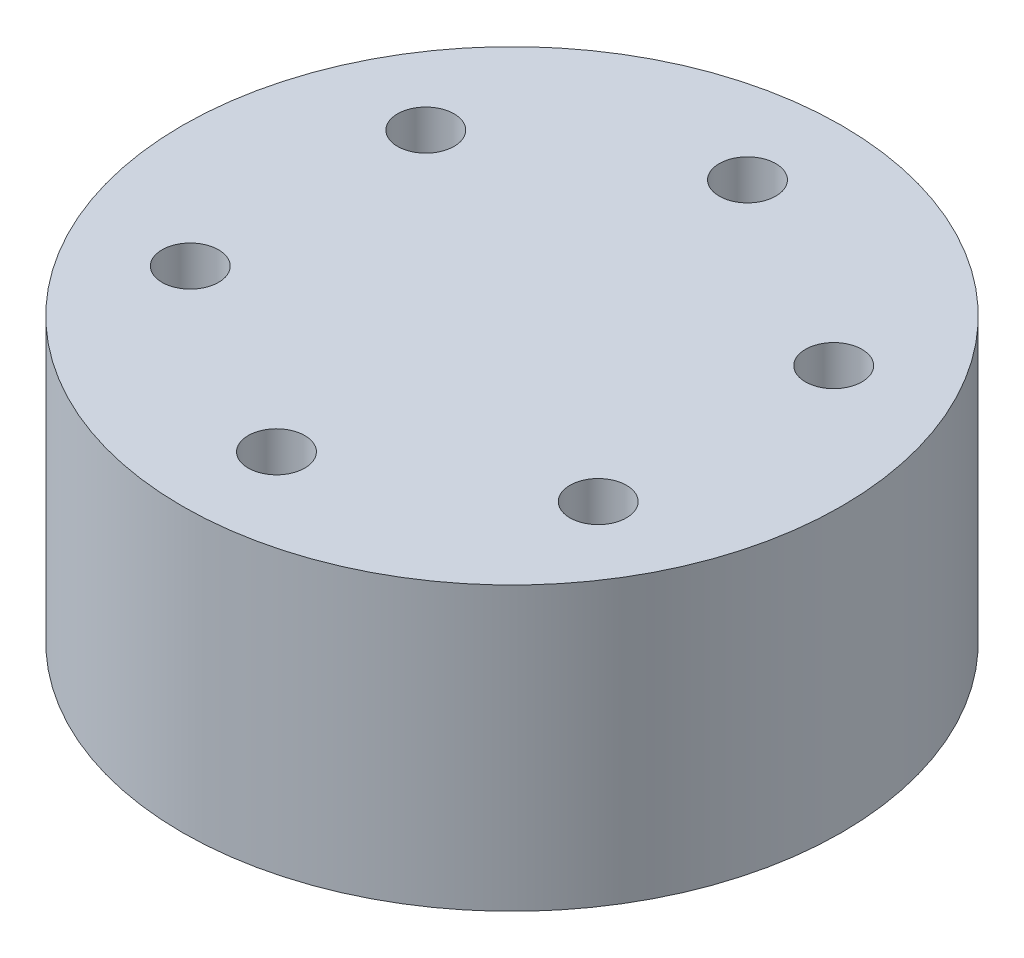
ISO-10303-21;
HEADER;
FILE_DESCRIPTION(('STEP AP214'),'2;1');
FILE_NAME('part.step','',(''),(''),'','','');
FILE_SCHEMA(('AUTOMOTIVE_DESIGN { 1 0 10303 214 1 1 1 1 }'));
ENDSEC;
DATA;
#1=APPLICATION_CONTEXT('core data for automotive mechanical design processes');
#2=APPLICATION_PROTOCOL_DEFINITION('international standard','automotive_design',2000,#1);
#3=PRODUCT_CONTEXT('',#1,'mechanical');
#4=PRODUCT('Part','Part','',(#3));
#5=PRODUCT_RELATED_PRODUCT_CATEGORY('part','',(#4));
#6=PRODUCT_DEFINITION_FORMATION('','',#4);
#7=PRODUCT_DEFINITION_CONTEXT('part definition',#1,'design');
#8=PRODUCT_DEFINITION('design','',#6,#7);
#9=PRODUCT_DEFINITION_SHAPE('','',#8);
#10=(LENGTH_UNIT() NAMED_UNIT(*) SI_UNIT(.MILLI.,.METRE.));
#11=(NAMED_UNIT(*) PLANE_ANGLE_UNIT() SI_UNIT($,.RADIAN.));
#12=(NAMED_UNIT(*) SI_UNIT($,.STERADIAN.) SOLID_ANGLE_UNIT());
#13=UNCERTAINTY_MEASURE_WITH_UNIT(LENGTH_MEASURE(1.E-05),#10,'distance_accuracy_value','');
#14=(GEOMETRIC_REPRESENTATION_CONTEXT(3) GLOBAL_UNCERTAINTY_ASSIGNED_CONTEXT((#13)) GLOBAL_UNIT_ASSIGNED_CONTEXT((#10,
#11,#12)) REPRESENTATION_CONTEXT('',''));
#15=CARTESIAN_POINT('',(0.,0.,0.));
#16=DIRECTION('',(0.,0.,1.));
#17=DIRECTION('',(1.,0.,0.));
#18=AXIS2_PLACEMENT_3D('',#15,#16,#17);
#19=CARTESIAN_POINT('',(0.,15.,0.));
#20=DIRECTION('',(0.,-1.,0.));
#21=DIRECTION('',(0.,0.,-1.));
#22=AXIS2_PLACEMENT_3D('',#19,#20,#21);
#23=CYLINDRICAL_SURFACE('',#22,17.5);
#24=CARTESIAN_POINT('',(0.,15.,0.));
#25=DIRECTION('',(0.,1.,0.));
#26=DIRECTION('',(0.,0.,1.));
#27=AXIS2_PLACEMENT_3D('',#24,#25,#26);
#28=CIRCLE('',#27,17.5);
#29=CARTESIAN_POINT('',(0.,15.,17.5));
#30=VERTEX_POINT('',#29);
#31=EDGE_CURVE('E10',#30,#30,#28,.T.);
#32=ORIENTED_EDGE('',*,*,#31,.F.);
#33=EDGE_LOOP('',(#32));
#34=FACE_BOUND('',#33,.T.);
#35=CARTESIAN_POINT('',(0.,0.,0.));
#36=DIRECTION('',(0.,1.,0.));
#37=DIRECTION('',(0.,0.,1.));
#38=AXIS2_PLACEMENT_3D('',#35,#36,#37);
#39=CIRCLE('',#38,17.5);
#40=CARTESIAN_POINT('',(0.,0.,17.5));
#41=VERTEX_POINT('',#40);
#42=EDGE_CURVE('E38',#41,#41,#39,.T.);
#43=ORIENTED_EDGE('',*,*,#42,.T.);
#44=EDGE_LOOP('',(#43));
#45=FACE_BOUND('',#44,.T.);
#46=ADVANCED_FACE('F35',(#34,#45),#23,.T.);
#47=CARTESIAN_POINT('',(0.,15.,0.));
#48=DIRECTION('',(0.,1.,0.));
#49=DIRECTION('',(0.,0.,1.));
#50=AXIS2_PLACEMENT_3D('',#47,#48,#49);
#51=PLANE('',#50);
#52=CARTESIAN_POINT('',(1.50233141545481E-12,15.,-12.5));
#53=DIRECTION('',(0.,1.,0.));
#54=DIRECTION('',(0.,0.,1.));
#55=AXIS2_PLACEMENT_3D('',#52,#53,#54);
#56=CIRCLE('',#55,1.50000000000143);
#57=CARTESIAN_POINT('',(1.50233141545481E-12,15.,-10.9999999999986));
#58=VERTEX_POINT('',#57);
#59=EDGE_CURVE('E72',#58,#58,#56,.T.);
#60=ORIENTED_EDGE('',*,*,#59,.F.);
#61=EDGE_LOOP('',(#60));
#62=FACE_BOUND('',#61,.T.);
#63=CARTESIAN_POINT('',(-10.8253175473044,15.,-6.25000000000069));
#64=DIRECTION('',(0.,1.,0.));
#65=DIRECTION('',(0.,0.,1.));
#66=AXIS2_PLACEMENT_3D('',#63,#64,#65);
#67=CIRCLE('',#66,1.5000000000013);
#68=CARTESIAN_POINT('',(-10.8253175473044,15.,-4.74999999999939));
#69=VERTEX_POINT('',#68);
#70=EDGE_CURVE('E51',#69,#69,#67,.T.);
#71=ORIENTED_EDGE('',*,*,#70,.F.);
#72=EDGE_LOOP('',(#71));
#73=FACE_BOUND('',#72,.T.);
#74=CARTESIAN_POINT('',(-10.8253175473052,15.,6.2499999999993));
#75=DIRECTION('',(0.,1.,0.));
#76=DIRECTION('',(0.,0.,1.));
#77=AXIS2_PLACEMENT_3D('',#74,#75,#76);
#78=CIRCLE('',#77,1.50000000000066);
#79=CARTESIAN_POINT('',(-10.8253175473052,15.,7.74999999999996));
#80=VERTEX_POINT('',#79);
#81=EDGE_CURVE('E50',#80,#80,#78,.T.);
#82=ORIENTED_EDGE('',*,*,#81,.F.);
#83=EDGE_LOOP('',(#82));
#84=FACE_BOUND('',#83,.T.);
#85=CARTESIAN_POINT('',(0.,15.,12.5));
#86=DIRECTION('',(0.,1.,0.));
#87=DIRECTION('',(0.,0.,1.));
#88=AXIS2_PLACEMENT_3D('',#85,#86,#87);
#89=CIRCLE('',#88,1.5);
#90=CARTESIAN_POINT('',(0.,15.,14.));
#91=VERTEX_POINT('',#90);
#92=EDGE_CURVE('E57',#91,#91,#89,.T.);
#93=ORIENTED_EDGE('',*,*,#92,.F.);
#94=EDGE_LOOP('',(#93));
#95=FACE_BOUND('',#94,.T.);
#96=CARTESIAN_POINT('',(10.8253175473058,15.,6.25000000000069));
#97=DIRECTION('',(0.,1.,0.));
#98=DIRECTION('',(0.,0.,1.));
#99=AXIS2_PLACEMENT_3D('',#96,#97,#98);
#100=CIRCLE('',#99,1.50000000000019);
#101=CARTESIAN_POINT('',(10.8253175473058,15.,7.75000000000088));
#102=VERTEX_POINT('',#101);
#103=EDGE_CURVE('E63',#102,#102,#100,.T.);
#104=ORIENTED_EDGE('',*,*,#103,.F.);
#105=EDGE_LOOP('',(#104));
#106=FACE_BOUND('',#105,.T.);
#107=CARTESIAN_POINT('',(10.8253175473066,15.,-6.24999999999931));
#108=DIRECTION('',(0.,1.,0.));
#109=DIRECTION('',(0.,0.,1.));
#110=AXIS2_PLACEMENT_3D('',#107,#108,#109);
#111=CIRCLE('',#110,1.50000000000089);
#112=CARTESIAN_POINT('',(10.8253175473066,15.,-4.74999999999842));
#113=VERTEX_POINT('',#112);
#114=EDGE_CURVE('E69',#113,#113,#111,.T.);
#115=ORIENTED_EDGE('',*,*,#114,.F.);
#116=EDGE_LOOP('',(#115));
#117=FACE_BOUND('',#116,.T.);
#118=ORIENTED_EDGE('',*,*,#31,.T.);
#119=EDGE_LOOP('',(#118));
#120=FACE_BOUND('',#119,.T.);
#121=ADVANCED_FACE('F92',(#62,#73,#84,#95,#106,#117,#120),#51,.T.);
#122=CARTESIAN_POINT('',(0.,0.,0.));
#123=DIRECTION('',(0.,1.,0.));
#124=DIRECTION('',(0.,0.,1.));
#125=AXIS2_PLACEMENT_3D('',#122,#123,#124);
#126=PLANE('',#125);
#127=ORIENTED_EDGE('',*,*,#42,.F.);
#128=EDGE_LOOP('',(#127));
#129=FACE_BOUND('',#128,.T.);
#130=ADVANCED_FACE('F95',(#129),#126,.F.);
#131=CARTESIAN_POINT('',(10.8253175473066,10.,-6.24999999999931));
#132=DIRECTION('',(0.,1.,0.));
#133=DIRECTION('',(0.,0.,1.));
#134=AXIS2_PLACEMENT_3D('',#131,#132,#133);
#135=CYLINDRICAL_SURFACE('',#134,1.50000000000089);
#136=CARTESIAN_POINT('',(10.8253175473066,10.,-6.24999999999931));
#137=DIRECTION('',(0.,1.,0.));
#138=DIRECTION('',(0.,0.,1.));
#139=AXIS2_PLACEMENT_3D('',#136,#137,#138);
#140=CIRCLE('',#139,1.50000000000089);
#141=CARTESIAN_POINT('',(10.8253175473066,10.,-4.74999999999842));
#142=VERTEX_POINT('',#141);
#143=EDGE_CURVE('E66',#142,#142,#140,.T.);
#144=ORIENTED_EDGE('',*,*,#143,.F.);
#145=EDGE_LOOP('',(#144));
#146=FACE_BOUND('',#145,.T.);
#147=ORIENTED_EDGE('',*,*,#114,.T.);
#148=EDGE_LOOP('',(#147));
#149=FACE_BOUND('',#148,.T.);
#150=ADVANCED_FACE('F107',(#146,#149),#135,.F.);
#151=CARTESIAN_POINT('',(10.8253175473066,10.,-6.24999999999931));
#152=DIRECTION('',(0.,1.,0.));
#153=DIRECTION('',(0.,0.,1.));
#154=AXIS2_PLACEMENT_3D('',#151,#152,#153);
#155=PLANE('',#154);
#156=ORIENTED_EDGE('',*,*,#143,.T.);
#157=EDGE_LOOP('',(#156));
#158=FACE_BOUND('',#157,.T.);
#159=ADVANCED_FACE('F109',(#158),#155,.T.);
#160=CARTESIAN_POINT('',(10.8253175473058,10.,6.25000000000069));
#161=DIRECTION('',(0.,1.,0.));
#162=DIRECTION('',(0.,0.,1.));
#163=AXIS2_PLACEMENT_3D('',#160,#161,#162);
#164=CYLINDRICAL_SURFACE('',#163,1.50000000000019);
#165=CARTESIAN_POINT('',(10.8253175473058,10.,6.25000000000069));
#166=DIRECTION('',(0.,1.,0.));
#167=DIRECTION('',(0.,0.,1.));
#168=AXIS2_PLACEMENT_3D('',#165,#166,#167);
#169=CIRCLE('',#168,1.50000000000019);
#170=CARTESIAN_POINT('',(10.8253175473058,10.,7.75000000000088));
#171=VERTEX_POINT('',#170);
#172=EDGE_CURVE('E60',#171,#171,#169,.T.);
#173=ORIENTED_EDGE('',*,*,#172,.F.);
#174=EDGE_LOOP('',(#173));
#175=FACE_BOUND('',#174,.T.);
#176=ORIENTED_EDGE('',*,*,#103,.T.);
#177=EDGE_LOOP('',(#176));
#178=FACE_BOUND('',#177,.T.);
#179=ADVANCED_FACE('F116',(#175,#178),#164,.F.);
#180=CARTESIAN_POINT('',(10.8253175473058,10.,6.25000000000069));
#181=DIRECTION('',(0.,1.,0.));
#182=DIRECTION('',(0.,0.,1.));
#183=AXIS2_PLACEMENT_3D('',#180,#181,#182);
#184=PLANE('',#183);
#185=ORIENTED_EDGE('',*,*,#172,.T.);
#186=EDGE_LOOP('',(#185));
#187=FACE_BOUND('',#186,.T.);
#188=ADVANCED_FACE('F165',(#187),#184,.T.);
#189=CARTESIAN_POINT('',(0.,10.,12.5));
#190=DIRECTION('',(0.,1.,0.));
#191=DIRECTION('',(0.,0.,1.));
#192=AXIS2_PLACEMENT_3D('',#189,#190,#191);
#193=CYLINDRICAL_SURFACE('',#192,1.5);
#194=CARTESIAN_POINT('',(0.,10.,12.5));
#195=DIRECTION('',(0.,1.,0.));
#196=DIRECTION('',(0.,0.,1.));
#197=AXIS2_PLACEMENT_3D('',#194,#195,#196);
#198=CIRCLE('',#197,1.5);
#199=CARTESIAN_POINT('',(0.,10.,14.));
#200=VERTEX_POINT('',#199);
#201=EDGE_CURVE('E54',#200,#200,#198,.T.);
#202=ORIENTED_EDGE('',*,*,#201,.F.);
#203=EDGE_LOOP('',(#202));
#204=FACE_BOUND('',#203,.T.);
#205=ORIENTED_EDGE('',*,*,#92,.T.);
#206=EDGE_LOOP('',(#205));
#207=FACE_BOUND('',#206,.T.);
#208=ADVANCED_FACE('F176',(#204,#207),#193,.F.);
#209=CARTESIAN_POINT('',(0.,10.,12.5));
#210=DIRECTION('',(0.,1.,0.));
#211=DIRECTION('',(0.,0.,1.));
#212=AXIS2_PLACEMENT_3D('',#209,#210,#211);
#213=PLANE('',#212);
#214=ORIENTED_EDGE('',*,*,#201,.T.);
#215=EDGE_LOOP('',(#214));
#216=FACE_BOUND('',#215,.T.);
#217=ADVANCED_FACE('F187',(#216),#213,.T.);
#218=CARTESIAN_POINT('',(-10.8253175473052,10.,6.2499999999993));
#219=DIRECTION('',(0.,1.,0.));
#220=DIRECTION('',(0.,0.,1.));
#221=AXIS2_PLACEMENT_3D('',#218,#219,#220);
#222=CYLINDRICAL_SURFACE('',#221,1.50000000000066);
#223=CARTESIAN_POINT('',(-10.8253175473052,10.,6.2499999999993));
#224=DIRECTION('',(0.,1.,0.));
#225=DIRECTION('',(0.,0.,1.));
#226=AXIS2_PLACEMENT_3D('',#223,#224,#225);
#227=CIRCLE('',#226,1.50000000000066);
#228=CARTESIAN_POINT('',(-10.8253175473052,10.,7.74999999999996));
#229=VERTEX_POINT('',#228);
#230=EDGE_CURVE('E47',#229,#229,#227,.T.);
#231=ORIENTED_EDGE('',*,*,#230,.F.);
#232=EDGE_LOOP('',(#231));
#233=FACE_BOUND('',#232,.T.);
#234=ORIENTED_EDGE('',*,*,#81,.T.);
#235=EDGE_LOOP('',(#234));
#236=FACE_BOUND('',#235,.T.);
#237=ADVANCED_FACE('F198',(#233,#236),#222,.F.);
#238=CARTESIAN_POINT('',(-10.8253175473052,10.,6.2499999999993));
#239=DIRECTION('',(0.,1.,0.));
#240=DIRECTION('',(0.,0.,1.));
#241=AXIS2_PLACEMENT_3D('',#238,#239,#240);
#242=PLANE('',#241);
#243=ORIENTED_EDGE('',*,*,#230,.T.);
#244=EDGE_LOOP('',(#243));
#245=FACE_BOUND('',#244,.T.);
#246=ADVANCED_FACE('F209',(#245),#242,.T.);
#247=CARTESIAN_POINT('',(-10.8253175473044,10.,-6.25000000000069));
#248=DIRECTION('',(0.,1.,0.));
#249=DIRECTION('',(0.,0.,1.));
#250=AXIS2_PLACEMENT_3D('',#247,#248,#249);
#251=CYLINDRICAL_SURFACE('',#250,1.5000000000013);
#252=CARTESIAN_POINT('',(-10.8253175473044,10.,-6.25000000000069));
#253=DIRECTION('',(0.,1.,0.));
#254=DIRECTION('',(0.,0.,1.));
#255=AXIS2_PLACEMENT_3D('',#252,#253,#254);
#256=CIRCLE('',#255,1.5000000000013);
#257=CARTESIAN_POINT('',(-10.8253175473044,10.,-4.74999999999939));
#258=VERTEX_POINT('',#257);
#259=EDGE_CURVE('E73',#258,#258,#256,.T.);
#260=ORIENTED_EDGE('',*,*,#259,.F.);
#261=EDGE_LOOP('',(#260));
#262=FACE_BOUND('',#261,.T.);
#263=ORIENTED_EDGE('',*,*,#70,.T.);
#264=EDGE_LOOP('',(#263));
#265=FACE_BOUND('',#264,.T.);
#266=ADVANCED_FACE('F220',(#262,#265),#251,.F.);
#267=CARTESIAN_POINT('',(-10.8253175473044,10.,-6.25000000000069));
#268=DIRECTION('',(0.,1.,0.));
#269=DIRECTION('',(0.,0.,1.));
#270=AXIS2_PLACEMENT_3D('',#267,#268,#269);
#271=PLANE('',#270);
#272=ORIENTED_EDGE('',*,*,#259,.T.);
#273=EDGE_LOOP('',(#272));
#274=FACE_BOUND('',#273,.T.);
#275=ADVANCED_FACE('F88',(#274),#271,.T.);
#276=CARTESIAN_POINT('',(1.50233141545481E-12,10.,-12.5));
#277=DIRECTION('',(0.,1.,0.));
#278=DIRECTION('',(0.,0.,1.));
#279=AXIS2_PLACEMENT_3D('',#276,#277,#278);
#280=CYLINDRICAL_SURFACE('',#279,1.50000000000143);
#281=CARTESIAN_POINT('',(1.50233141545481E-12,10.,-12.5));
#282=DIRECTION('',(0.,1.,0.));
#283=DIRECTION('',(0.,0.,1.));
#284=AXIS2_PLACEMENT_3D('',#281,#282,#283);
#285=CIRCLE('',#284,1.50000000000143);
#286=CARTESIAN_POINT('',(1.50233141545481E-12,10.,-10.9999999999986));
#287=VERTEX_POINT('',#286);
#288=EDGE_CURVE('E45',#287,#287,#285,.T.);
#289=ORIENTED_EDGE('',*,*,#288,.F.);
#290=EDGE_LOOP('',(#289));
#291=FACE_BOUND('',#290,.T.);
#292=ORIENTED_EDGE('',*,*,#59,.T.);
#293=EDGE_LOOP('',(#292));
#294=FACE_BOUND('',#293,.T.);
#295=ADVANCED_FACE('F85',(#291,#294),#280,.F.);
#296=CARTESIAN_POINT('',(1.50233141545481E-12,10.,-12.5));
#297=DIRECTION('',(0.,1.,0.));
#298=DIRECTION('',(0.,0.,1.));
#299=AXIS2_PLACEMENT_3D('',#296,#297,#298);
#300=PLANE('',#299);
#301=ORIENTED_EDGE('',*,*,#288,.T.);
#302=EDGE_LOOP('',(#301));
#303=FACE_BOUND('',#302,.T.);
#304=ADVANCED_FACE('F83',(#303),#300,.T.);
#305=CLOSED_SHELL('',(#46,#121,#130,#150,#159,#179,#188,#208,#217,#237,#246,#266,#275,#295,#304));
#306=MANIFOLD_SOLID_BREP('B2',#305);
#307=ADVANCED_BREP_SHAPE_REPRESENTATION('',(#18,#306),#14);
#308=SHAPE_DEFINITION_REPRESENTATION(#9,#307);
ENDSEC;
END-ISO-10303-21;
